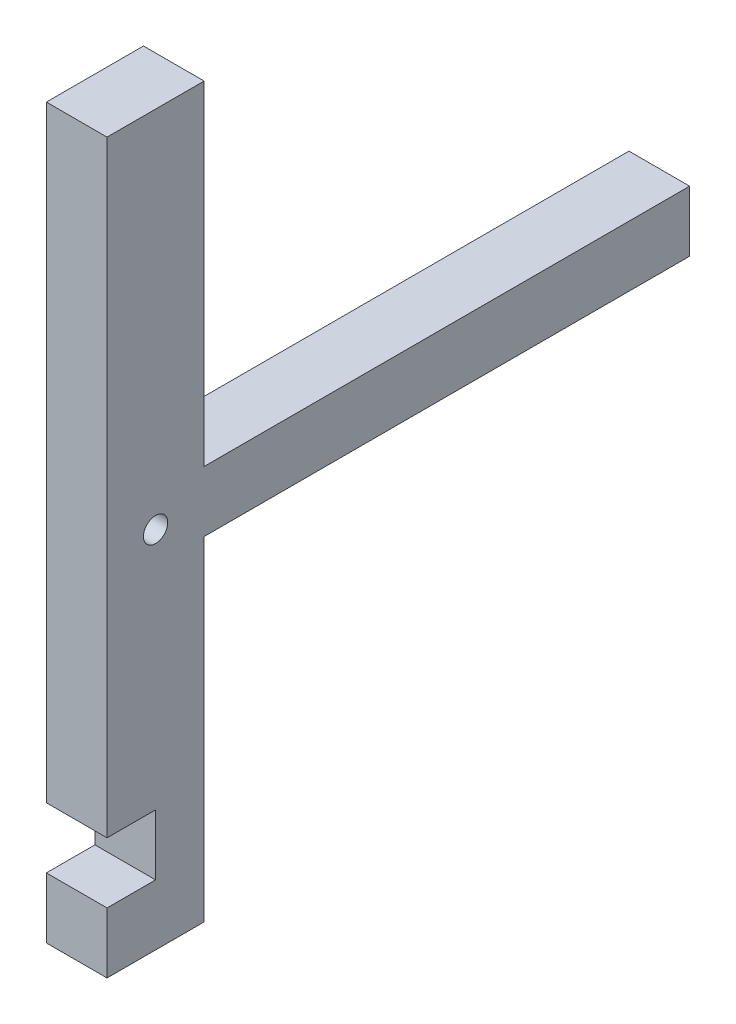
ISO-10303-21;
HEADER;
FILE_DESCRIPTION(('STEP AP214'),'2;1');
FILE_NAME('part.step','',(''),(''),'','','');
FILE_SCHEMA(('AUTOMOTIVE_DESIGN { 1 0 10303 214 1 1 1 1 }'));
ENDSEC;
DATA;
#1=APPLICATION_CONTEXT('core data for automotive mechanical design processes');
#2=APPLICATION_PROTOCOL_DEFINITION('international standard','automotive_design',2000,#1);
#3=PRODUCT_CONTEXT('',#1,'mechanical');
#4=PRODUCT('Part','Part','',(#3));
#5=PRODUCT_RELATED_PRODUCT_CATEGORY('part','',(#4));
#6=PRODUCT_DEFINITION_FORMATION('','',#4);
#7=PRODUCT_DEFINITION_CONTEXT('part definition',#1,'design');
#8=PRODUCT_DEFINITION('design','',#6,#7);
#9=PRODUCT_DEFINITION_SHAPE('','',#8);
#10=(LENGTH_UNIT() NAMED_UNIT(*) SI_UNIT(.MILLI.,.METRE.));
#11=(NAMED_UNIT(*) PLANE_ANGLE_UNIT() SI_UNIT($,.RADIAN.));
#12=(NAMED_UNIT(*) SI_UNIT($,.STERADIAN.) SOLID_ANGLE_UNIT());
#13=UNCERTAINTY_MEASURE_WITH_UNIT(LENGTH_MEASURE(1.E-05),#10,'distance_accuracy_value','');
#14=(GEOMETRIC_REPRESENTATION_CONTEXT(3) GLOBAL_UNCERTAINTY_ASSIGNED_CONTEXT((#13)) GLOBAL_UNIT_ASSIGNED_CONTEXT((#10,
#11,#12)) REPRESENTATION_CONTEXT('',''));
#15=CARTESIAN_POINT('',(0.,0.,0.));
#16=DIRECTION('',(0.,0.,1.));
#17=DIRECTION('',(1.,0.,0.));
#18=AXIS2_PLACEMENT_3D('',#15,#16,#17);
#19=CARTESIAN_POINT('',(6.35,0.,5.08));
#20=DIRECTION('',(0.,0.,1.));
#21=DIRECTION('',(1.,0.,0.));
#22=AXIS2_PLACEMENT_3D('',#19,#20,#21);
#23=PLANE('',#22);
#24=DIRECTION('',(0.,1.,0.));
#25=VECTOR('',#24,1.);
#26=CARTESIAN_POINT('',(0.,0.,5.08));
#27=LINE('',#26,#25);
#28=CARTESIAN_POINT('',(0.,-25.4,5.08));
#29=VERTEX_POINT('',#28);
#30=CARTESIAN_POINT('',(0.,38.1,5.08));
#31=VERTEX_POINT('',#30);
#32=EDGE_CURVE('E158',#29,#31,#27,.T.);
#33=ORIENTED_EDGE('',*,*,#32,.F.);
#34=DIRECTION('',(-1.,0.,0.));
#35=VECTOR('',#34,1.);
#36=CARTESIAN_POINT('',(6.35,-25.4,5.08));
#37=LINE('',#36,#35);
#38=CARTESIAN_POINT('',(6.35,-25.4,5.08));
#39=VERTEX_POINT('',#38);
#40=EDGE_CURVE('E11',#39,#29,#37,.T.);
#41=ORIENTED_EDGE('',*,*,#40,.F.);
#42=DIRECTION('',(0.,1.,0.));
#43=VECTOR('',#42,1.);
#44=CARTESIAN_POINT('',(6.35,0.,5.08));
#45=LINE('',#44,#43);
#46=CARTESIAN_POINT('',(6.35,38.1,5.08));
#47=VERTEX_POINT('',#46);
#48=EDGE_CURVE('E234',#39,#47,#45,.T.);
#49=ORIENTED_EDGE('',*,*,#48,.T.);
#50=DIRECTION('',(-1.,0.,0.));
#51=VECTOR('',#50,1.);
#52=CARTESIAN_POINT('',(6.35,38.1,5.08));
#53=LINE('',#52,#51);
#54=EDGE_CURVE('E52',#47,#31,#53,.T.);
#55=ORIENTED_EDGE('',*,*,#54,.T.);
#56=EDGE_LOOP('',(#33,#41,#49,#55));
#57=FACE_BOUND('',#56,.T.);
#58=ADVANCED_FACE('F35',(#57),#23,.T.);
#59=CARTESIAN_POINT('',(6.35,-25.4,0.));
#60=DIRECTION('',(0.,1.,0.));
#61=DIRECTION('',(0.,0.,1.));
#62=AXIS2_PLACEMENT_3D('',#59,#60,#61);
#63=PLANE('',#62);
#64=DIRECTION('',(0.,0.,-1.));
#65=VECTOR('',#64,1.);
#66=CARTESIAN_POINT('',(0.,-25.4,0.));
#67=LINE('',#66,#65);
#68=CARTESIAN_POINT('',(0.,-25.4,0.));
#69=VERTEX_POINT('',#68);
#70=EDGE_CURVE('E160',#29,#69,#67,.T.);
#71=ORIENTED_EDGE('',*,*,#70,.T.);
#72=DIRECTION('',(-1.,0.,0.));
#73=VECTOR('',#72,1.);
#74=CARTESIAN_POINT('',(6.35,-25.4,0.));
#75=LINE('',#74,#73);
#76=CARTESIAN_POINT('',(6.35,-25.4,0.));
#77=VERTEX_POINT('',#76);
#78=EDGE_CURVE('E44',#77,#69,#75,.T.);
#79=ORIENTED_EDGE('',*,*,#78,.F.);
#80=DIRECTION('',(0.,0.,-1.));
#81=VECTOR('',#80,1.);
#82=CARTESIAN_POINT('',(6.35,-25.4,0.));
#83=LINE('',#82,#81);
#84=EDGE_CURVE('E230',#39,#77,#83,.T.);
#85=ORIENTED_EDGE('',*,*,#84,.F.);
#86=ORIENTED_EDGE('',*,*,#40,.T.);
#87=EDGE_LOOP('',(#71,#79,#85,#86));
#88=FACE_BOUND('',#87,.T.);
#89=ADVANCED_FACE('F217',(#88),#63,.F.);
#90=CARTESIAN_POINT('',(6.35,0.,0.));
#91=DIRECTION('',(0.,0.,1.));
#92=DIRECTION('',(0.,-1.,0.));
#93=AXIS2_PLACEMENT_3D('',#90,#91,#92);
#94=PLANE('',#93);
#95=DIRECTION('',(0.,1.,0.));
#96=VECTOR('',#95,1.);
#97=CARTESIAN_POINT('',(0.,0.,0.));
#98=LINE('',#97,#96);
#99=CARTESIAN_POINT('',(0.,-31.75,0.));
#100=VERTEX_POINT('',#99);
#101=EDGE_CURVE('E163',#100,#69,#98,.T.);
#102=ORIENTED_EDGE('',*,*,#101,.F.);
#103=DIRECTION('',(-1.,0.,0.));
#104=VECTOR('',#103,1.);
#105=CARTESIAN_POINT('',(6.35,-31.75,0.));
#106=LINE('',#105,#104);
#107=CARTESIAN_POINT('',(6.35,-31.75,0.));
#108=VERTEX_POINT('',#107);
#109=EDGE_CURVE('E207',#108,#100,#106,.T.);
#110=ORIENTED_EDGE('',*,*,#109,.F.);
#111=DIRECTION('',(0.,1.,0.));
#112=VECTOR('',#111,1.);
#113=CARTESIAN_POINT('',(6.35,0.,0.));
#114=LINE('',#113,#112);
#115=EDGE_CURVE('E214',#108,#77,#114,.T.);
#116=ORIENTED_EDGE('',*,*,#115,.T.);
#117=ORIENTED_EDGE('',*,*,#78,.T.);
#118=EDGE_LOOP('',(#102,#110,#116,#117));
#119=FACE_BOUND('',#118,.T.);
#120=ADVANCED_FACE('F212',(#119),#94,.T.);
#121=CARTESIAN_POINT('',(6.35,-31.75,0.));
#122=DIRECTION('',(0.,1.,0.));
#123=DIRECTION('',(0.,0.,1.));
#124=AXIS2_PLACEMENT_3D('',#121,#122,#123);
#125=PLANE('',#124);
#126=DIRECTION('',(0.,0.,-1.));
#127=VECTOR('',#126,1.);
#128=CARTESIAN_POINT('',(0.,-31.75,0.));
#129=LINE('',#128,#127);
#130=CARTESIAN_POINT('',(0.,-31.75,5.08));
#131=VERTEX_POINT('',#130);
#132=EDGE_CURVE('E166',#131,#100,#129,.T.);
#133=ORIENTED_EDGE('',*,*,#132,.F.);
#134=DIRECTION('',(-1.,0.,0.));
#135=VECTOR('',#134,1.);
#136=CARTESIAN_POINT('',(6.35,-31.75,5.08));
#137=LINE('',#136,#135);
#138=CARTESIAN_POINT('',(6.35,-31.75,5.08));
#139=VERTEX_POINT('',#138);
#140=EDGE_CURVE('E205',#139,#131,#137,.T.);
#141=ORIENTED_EDGE('',*,*,#140,.F.);
#142=DIRECTION('',(0.,0.,-1.));
#143=VECTOR('',#142,1.);
#144=CARTESIAN_POINT('',(6.35,-31.75,0.));
#145=LINE('',#144,#143);
#146=EDGE_CURVE('E227',#139,#108,#145,.T.);
#147=ORIENTED_EDGE('',*,*,#146,.T.);
#148=ORIENTED_EDGE('',*,*,#109,.T.);
#149=EDGE_LOOP('',(#133,#141,#147,#148));
#150=FACE_BOUND('',#149,.T.);
#151=ADVANCED_FACE('F224',(#150),#125,.T.);
#152=CARTESIAN_POINT('',(6.35,0.,5.08));
#153=DIRECTION('',(0.,0.,1.));
#154=DIRECTION('',(1.,0.,0.));
#155=AXIS2_PLACEMENT_3D('',#152,#153,#154);
#156=PLANE('',#155);
#157=DIRECTION('',(0.,1.,0.));
#158=VECTOR('',#157,1.);
#159=CARTESIAN_POINT('',(0.,0.,5.08));
#160=LINE('',#159,#158);
#161=CARTESIAN_POINT('',(0.,-38.1,5.08));
#162=VERTEX_POINT('',#161);
#163=EDGE_CURVE('E169',#162,#131,#160,.T.);
#164=ORIENTED_EDGE('',*,*,#163,.F.);
#165=DIRECTION('',(-1.,0.,0.));
#166=VECTOR('',#165,1.);
#167=CARTESIAN_POINT('',(6.35,-38.1,5.08));
#168=LINE('',#167,#166);
#169=CARTESIAN_POINT('',(6.35,-38.1,5.08));
#170=VERTEX_POINT('',#169);
#171=EDGE_CURVE('E203',#170,#162,#168,.T.);
#172=ORIENTED_EDGE('',*,*,#171,.F.);
#173=DIRECTION('',(0.,1.,0.));
#174=VECTOR('',#173,1.);
#175=CARTESIAN_POINT('',(6.35,0.,5.08));
#176=LINE('',#175,#174);
#177=EDGE_CURVE('E232',#170,#139,#176,.T.);
#178=ORIENTED_EDGE('',*,*,#177,.T.);
#179=ORIENTED_EDGE('',*,*,#140,.T.);
#180=EDGE_LOOP('',(#164,#172,#178,#179));
#181=FACE_BOUND('',#180,.T.);
#182=ADVANCED_FACE('F272',(#181),#156,.T.);
#183=CARTESIAN_POINT('',(6.35,-38.1,0.));
#184=DIRECTION('',(0.,1.,0.));
#185=DIRECTION('',(0.,0.,1.));
#186=AXIS2_PLACEMENT_3D('',#183,#184,#185);
#187=PLANE('',#186);
#188=DIRECTION('',(0.,0.,-1.));
#189=VECTOR('',#188,1.);
#190=CARTESIAN_POINT('',(0.,-38.1,0.));
#191=LINE('',#190,#189);
#192=CARTESIAN_POINT('',(0.,-38.1,-5.08));
#193=VERTEX_POINT('',#192);
#194=EDGE_CURVE('E172',#162,#193,#191,.T.);
#195=ORIENTED_EDGE('',*,*,#194,.T.);
#196=DIRECTION('',(-1.,0.,0.));
#197=VECTOR('',#196,1.);
#198=CARTESIAN_POINT('',(6.35,-38.1,-5.08));
#199=LINE('',#198,#197);
#200=CARTESIAN_POINT('',(6.35,-38.1,-5.08));
#201=VERTEX_POINT('',#200);
#202=EDGE_CURVE('E200',#201,#193,#199,.T.);
#203=ORIENTED_EDGE('',*,*,#202,.F.);
#204=DIRECTION('',(0.,0.,-1.));
#205=VECTOR('',#204,1.);
#206=CARTESIAN_POINT('',(6.35,-38.1,0.));
#207=LINE('',#206,#205);
#208=EDGE_CURVE('E239',#170,#201,#207,.T.);
#209=ORIENTED_EDGE('',*,*,#208,.F.);
#210=ORIENTED_EDGE('',*,*,#171,.T.);
#211=EDGE_LOOP('',(#195,#203,#209,#210));
#212=FACE_BOUND('',#211,.T.);
#213=ADVANCED_FACE('F275',(#212),#187,.F.);
#214=CARTESIAN_POINT('',(6.35,0.,-5.08000000000001));
#215=DIRECTION('',(0.,0.,1.));
#216=DIRECTION('',(0.,-1.,0.));
#217=AXIS2_PLACEMENT_3D('',#214,#215,#216);
#218=PLANE('',#217);
#219=DIRECTION('',(0.,1.,0.));
#220=VECTOR('',#219,1.);
#221=CARTESIAN_POINT('',(0.,0.,-5.08000000000001));
#222=LINE('',#221,#220);
#223=CARTESIAN_POINT('',(0.,-3.175,-5.08000000000001));
#224=VERTEX_POINT('',#223);
#225=EDGE_CURVE('E175',#193,#224,#222,.T.);
#226=ORIENTED_EDGE('',*,*,#225,.T.);
#227=DIRECTION('',(-1.,0.,0.));
#228=VECTOR('',#227,1.);
#229=CARTESIAN_POINT('',(6.35,-3.175,-5.08000000000001));
#230=LINE('',#229,#228);
#231=CARTESIAN_POINT('',(6.35,-3.175,-5.08000000000001));
#232=VERTEX_POINT('',#231);
#233=EDGE_CURVE('E197',#232,#224,#230,.T.);
#234=ORIENTED_EDGE('',*,*,#233,.F.);
#235=DIRECTION('',(0.,1.,0.));
#236=VECTOR('',#235,1.);
#237=CARTESIAN_POINT('',(6.35,0.,-5.08000000000001));
#238=LINE('',#237,#236);
#239=EDGE_CURVE('E242',#201,#232,#238,.T.);
#240=ORIENTED_EDGE('',*,*,#239,.F.);
#241=ORIENTED_EDGE('',*,*,#202,.T.);
#242=EDGE_LOOP('',(#226,#234,#240,#241));
#243=FACE_BOUND('',#242,.T.);
#244=ADVANCED_FACE('F279',(#243),#218,.F.);
#245=CARTESIAN_POINT('',(6.35,-3.175,0.));
#246=DIRECTION('',(0.,1.,0.));
#247=DIRECTION('',(0.,0.,1.));
#248=AXIS2_PLACEMENT_3D('',#245,#246,#247);
#249=PLANE('',#248);
#250=DIRECTION('',(0.,0.,-1.));
#251=VECTOR('',#250,1.);
#252=CARTESIAN_POINT('',(0.,-3.175,0.));
#253=LINE('',#252,#251);
#254=CARTESIAN_POINT('',(0.,-3.175,-55.88));
#255=VERTEX_POINT('',#254);
#256=EDGE_CURVE('E178',#224,#255,#253,.T.);
#257=ORIENTED_EDGE('',*,*,#256,.T.);
#258=DIRECTION('',(-1.,0.,0.));
#259=VECTOR('',#258,1.);
#260=CARTESIAN_POINT('',(6.35,-3.175,-55.88));
#261=LINE('',#260,#259);
#262=CARTESIAN_POINT('',(6.35,-3.175,-55.88));
#263=VERTEX_POINT('',#262);
#264=EDGE_CURVE('E194',#263,#255,#261,.T.);
#265=ORIENTED_EDGE('',*,*,#264,.F.);
#266=DIRECTION('',(0.,0.,-1.));
#267=VECTOR('',#266,1.);
#268=CARTESIAN_POINT('',(6.35,-3.175,0.));
#269=LINE('',#268,#267);
#270=EDGE_CURVE('E150',#232,#263,#269,.T.);
#271=ORIENTED_EDGE('',*,*,#270,.F.);
#272=ORIENTED_EDGE('',*,*,#233,.T.);
#273=EDGE_LOOP('',(#257,#265,#271,#272));
#274=FACE_BOUND('',#273,.T.);
#275=ADVANCED_FACE('F247',(#274),#249,.F.);
#276=CARTESIAN_POINT('',(6.35,0.,-55.88));
#277=DIRECTION('',(0.,0.,1.));
#278=DIRECTION('',(1.,0.,0.));
#279=AXIS2_PLACEMENT_3D('',#276,#277,#278);
#280=PLANE('',#279);
#281=DIRECTION('',(0.,1.,0.));
#282=VECTOR('',#281,1.);
#283=CARTESIAN_POINT('',(0.,0.,-55.88));
#284=LINE('',#283,#282);
#285=CARTESIAN_POINT('',(0.,3.175,-55.88));
#286=VERTEX_POINT('',#285);
#287=EDGE_CURVE('E181',#255,#286,#284,.T.);
#288=ORIENTED_EDGE('',*,*,#287,.T.);
#289=DIRECTION('',(-1.,0.,0.));
#290=VECTOR('',#289,1.);
#291=CARTESIAN_POINT('',(6.35,3.175,-55.88));
#292=LINE('',#291,#290);
#293=CARTESIAN_POINT('',(6.35,3.175,-55.88));
#294=VERTEX_POINT('',#293);
#295=EDGE_CURVE('E136',#294,#286,#292,.T.);
#296=ORIENTED_EDGE('',*,*,#295,.F.);
#297=DIRECTION('',(0.,1.,0.));
#298=VECTOR('',#297,1.);
#299=CARTESIAN_POINT('',(6.35,0.,-55.88));
#300=LINE('',#299,#298);
#301=EDGE_CURVE('E147',#263,#294,#300,.T.);
#302=ORIENTED_EDGE('',*,*,#301,.F.);
#303=ORIENTED_EDGE('',*,*,#264,.T.);
#304=EDGE_LOOP('',(#288,#296,#302,#303));
#305=FACE_BOUND('',#304,.T.);
#306=ADVANCED_FACE('F249',(#305),#280,.F.);
#307=CARTESIAN_POINT('',(6.35,3.175,0.));
#308=DIRECTION('',(0.,1.,0.));
#309=DIRECTION('',(0.,0.,1.));
#310=AXIS2_PLACEMENT_3D('',#307,#308,#309);
#311=PLANE('',#310);
#312=DIRECTION('',(0.,0.,-1.));
#313=VECTOR('',#312,1.);
#314=CARTESIAN_POINT('',(0.,3.175,0.));
#315=LINE('',#314,#313);
#316=CARTESIAN_POINT('',(0.,3.175,-5.08000000000001));
#317=VERTEX_POINT('',#316);
#318=EDGE_CURVE('E133',#317,#286,#315,.T.);
#319=ORIENTED_EDGE('',*,*,#318,.F.);
#320=DIRECTION('',(-1.,0.,0.));
#321=VECTOR('',#320,1.);
#322=CARTESIAN_POINT('',(6.35,3.175,-5.08000000000001));
#323=LINE('',#322,#321);
#324=CARTESIAN_POINT('',(6.35,3.175,-5.08000000000001));
#325=VERTEX_POINT('',#324);
#326=EDGE_CURVE('E127',#325,#317,#323,.T.);
#327=ORIENTED_EDGE('',*,*,#326,.F.);
#328=DIRECTION('',(0.,0.,-1.));
#329=VECTOR('',#328,1.);
#330=CARTESIAN_POINT('',(6.35,3.175,0.));
#331=LINE('',#330,#329);
#332=EDGE_CURVE('E131',#325,#294,#331,.T.);
#333=ORIENTED_EDGE('',*,*,#332,.T.);
#334=ORIENTED_EDGE('',*,*,#295,.T.);
#335=EDGE_LOOP('',(#319,#327,#333,#334));
#336=FACE_BOUND('',#335,.T.);
#337=ADVANCED_FACE('F129',(#336),#311,.T.);
#338=CARTESIAN_POINT('',(6.35,0.,-5.08000000000001));
#339=DIRECTION('',(0.,0.,1.));
#340=DIRECTION('',(0.,-1.,0.));
#341=AXIS2_PLACEMENT_3D('',#338,#339,#340);
#342=PLANE('',#341);
#343=DIRECTION('',(0.,1.,0.));
#344=VECTOR('',#343,1.);
#345=CARTESIAN_POINT('',(0.,0.,-5.08000000000001));
#346=LINE('',#345,#344);
#347=CARTESIAN_POINT('',(0.,38.1,-5.08));
#348=VERTEX_POINT('',#347);
#349=EDGE_CURVE('E185',#317,#348,#346,.T.);
#350=ORIENTED_EDGE('',*,*,#349,.T.);
#351=DIRECTION('',(-1.,0.,0.));
#352=VECTOR('',#351,1.);
#353=CARTESIAN_POINT('',(6.35,38.1,-5.08));
#354=LINE('',#353,#352);
#355=CARTESIAN_POINT('',(6.35,38.1,-5.08));
#356=VERTEX_POINT('',#355);
#357=EDGE_CURVE('E90',#356,#348,#354,.T.);
#358=ORIENTED_EDGE('',*,*,#357,.F.);
#359=DIRECTION('',(0.,1.,0.));
#360=VECTOR('',#359,1.);
#361=CARTESIAN_POINT('',(6.35,0.,-5.08000000000001));
#362=LINE('',#361,#360);
#363=EDGE_CURVE('E138',#325,#356,#362,.T.);
#364=ORIENTED_EDGE('',*,*,#363,.F.);
#365=ORIENTED_EDGE('',*,*,#326,.T.);
#366=EDGE_LOOP('',(#350,#358,#364,#365));
#367=FACE_BOUND('',#366,.T.);
#368=ADVANCED_FACE('F139',(#367),#342,.F.);
#369=CARTESIAN_POINT('',(6.35,0.,0.));
#370=DIRECTION('',(-1.,0.,0.));
#371=DIRECTION('',(0.,0.,1.));
#372=AXIS2_PLACEMENT_3D('',#369,#370,#371);
#373=CYLINDRICAL_SURFACE('',#372,1.27);
#374=CARTESIAN_POINT('',(6.35,0.,0.));
#375=DIRECTION('',(1.,0.,0.));
#376=DIRECTION('',(0.,0.,-1.));
#377=AXIS2_PLACEMENT_3D('',#374,#375,#376);
#378=CIRCLE('',#377,1.27);
#379=CARTESIAN_POINT('',(6.35,0.,-1.27));
#380=VERTEX_POINT('',#379);
#381=EDGE_CURVE('E190',#380,#380,#378,.T.);
#382=ORIENTED_EDGE('',*,*,#381,.T.);
#383=EDGE_LOOP('',(#382));
#384=FACE_BOUND('',#383,.T.);
#385=CARTESIAN_POINT('',(0.,0.,0.));
#386=DIRECTION('',(1.,0.,0.));
#387=DIRECTION('',(0.,0.,-1.));
#388=AXIS2_PLACEMENT_3D('',#385,#386,#387);
#389=CIRCLE('',#388,1.27);
#390=CARTESIAN_POINT('',(0.,0.,-1.27));
#391=VERTEX_POINT('',#390);
#392=EDGE_CURVE('E155',#391,#391,#389,.T.);
#393=ORIENTED_EDGE('',*,*,#392,.F.);
#394=EDGE_LOOP('',(#393));
#395=FACE_BOUND('',#394,.T.);
#396=ADVANCED_FACE('F37',(#384,#395),#373,.F.);
#397=CARTESIAN_POINT('',(6.35,38.1,0.));
#398=DIRECTION('',(0.,1.,0.));
#399=DIRECTION('',(0.,0.,1.));
#400=AXIS2_PLACEMENT_3D('',#397,#398,#399);
#401=PLANE('',#400);
#402=DIRECTION('',(0.,0.,-1.));
#403=VECTOR('',#402,1.);
#404=CARTESIAN_POINT('',(0.,38.1,0.));
#405=LINE('',#404,#403);
#406=EDGE_CURVE('E187',#31,#348,#405,.T.);
#407=ORIENTED_EDGE('',*,*,#406,.F.);
#408=ORIENTED_EDGE('',*,*,#54,.F.);
#409=DIRECTION('',(0.,0.,-1.));
#410=VECTOR('',#409,1.);
#411=CARTESIAN_POINT('',(6.35,38.1,0.));
#412=LINE('',#411,#410);
#413=EDGE_CURVE('E142',#47,#356,#412,.T.);
#414=ORIENTED_EDGE('',*,*,#413,.T.);
#415=ORIENTED_EDGE('',*,*,#357,.T.);
#416=EDGE_LOOP('',(#407,#408,#414,#415));
#417=FACE_BOUND('',#416,.T.);
#418=ADVANCED_FACE('F250',(#417),#401,.T.);
#419=CARTESIAN_POINT('',(6.35,0.,0.));
#420=DIRECTION('',(1.,0.,0.));
#421=DIRECTION('',(0.,0.,-1.));
#422=AXIS2_PLACEMENT_3D('',#419,#420,#421);
#423=PLANE('',#422);
#424=ORIENTED_EDGE('',*,*,#381,.F.);
#425=EDGE_LOOP('',(#424));
#426=FACE_BOUND('',#425,.T.);
#427=ORIENTED_EDGE('',*,*,#48,.F.);
#428=ORIENTED_EDGE('',*,*,#84,.T.);
#429=ORIENTED_EDGE('',*,*,#115,.F.);
#430=ORIENTED_EDGE('',*,*,#146,.F.);
#431=ORIENTED_EDGE('',*,*,#177,.F.);
#432=ORIENTED_EDGE('',*,*,#208,.T.);
#433=ORIENTED_EDGE('',*,*,#239,.T.);
#434=ORIENTED_EDGE('',*,*,#270,.T.);
#435=ORIENTED_EDGE('',*,*,#301,.T.);
#436=ORIENTED_EDGE('',*,*,#332,.F.);
#437=ORIENTED_EDGE('',*,*,#363,.T.);
#438=ORIENTED_EDGE('',*,*,#413,.F.);
#439=EDGE_LOOP('',(#427,#428,#429,#430,#431,#432,#433,#434,#435,#436,#437,#438));
#440=FACE_BOUND('',#439,.T.);
#441=ADVANCED_FACE('F145',(#426,#440),#423,.T.);
#442=CARTESIAN_POINT('',(0.,0.,0.));
#443=DIRECTION('',(1.,0.,0.));
#444=DIRECTION('',(0.,0.,-1.));
#445=AXIS2_PLACEMENT_3D('',#442,#443,#444);
#446=PLANE('',#445);
#447=ORIENTED_EDGE('',*,*,#392,.T.);
#448=EDGE_LOOP('',(#447));
#449=FACE_BOUND('',#448,.T.);
#450=ORIENTED_EDGE('',*,*,#32,.T.);
#451=ORIENTED_EDGE('',*,*,#406,.T.);
#452=ORIENTED_EDGE('',*,*,#349,.F.);
#453=ORIENTED_EDGE('',*,*,#318,.T.);
#454=ORIENTED_EDGE('',*,*,#287,.F.);
#455=ORIENTED_EDGE('',*,*,#256,.F.);
#456=ORIENTED_EDGE('',*,*,#225,.F.);
#457=ORIENTED_EDGE('',*,*,#194,.F.);
#458=ORIENTED_EDGE('',*,*,#163,.T.);
#459=ORIENTED_EDGE('',*,*,#132,.T.);
#460=ORIENTED_EDGE('',*,*,#101,.T.);
#461=ORIENTED_EDGE('',*,*,#70,.F.);
#462=EDGE_LOOP('',(#450,#451,#452,#453,#454,#455,#456,#457,#458,#459,#460,#461));
#463=FACE_BOUND('',#462,.T.);
#464=ADVANCED_FACE('F219',(#449,#463),#446,.F.);
#465=CLOSED_SHELL('',(#58,#89,#120,#151,#182,#213,#244,#275,#306,#337,#368,#396,#418,#441,#464));
#466=MANIFOLD_SOLID_BREP('B2',#465);
#467=ADVANCED_BREP_SHAPE_REPRESENTATION('',(#18,#466),#14);
#468=SHAPE_DEFINITION_REPRESENTATION(#9,#467);
ENDSEC;
END-ISO-10303-21;
